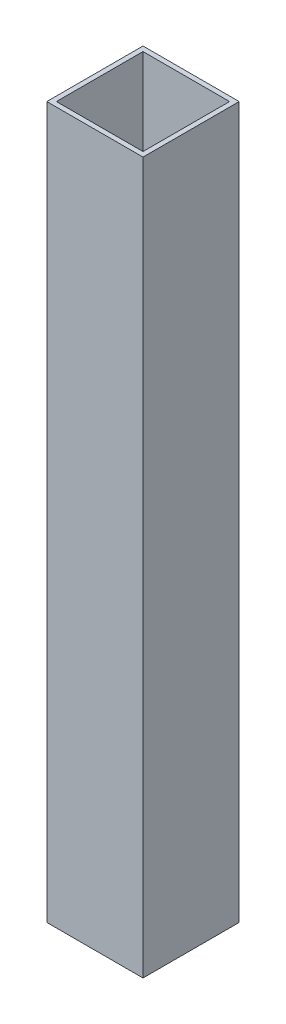
ISO-10303-21;
HEADER;
FILE_DESCRIPTION(('STEP AP214'),'2;1');
FILE_NAME('part.step','',(''),(''),'','','');
FILE_SCHEMA(('AUTOMOTIVE_DESIGN { 1 0 10303 214 1 1 1 1 }'));
ENDSEC;
DATA;
#1=APPLICATION_CONTEXT('core data for automotive mechanical design processes');
#2=APPLICATION_PROTOCOL_DEFINITION('international standard','automotive_design',2000,#1);
#3=PRODUCT_CONTEXT('',#1,'mechanical');
#4=PRODUCT('Part','Part','',(#3));
#5=PRODUCT_RELATED_PRODUCT_CATEGORY('part','',(#4));
#6=PRODUCT_DEFINITION_FORMATION('','',#4);
#7=PRODUCT_DEFINITION_CONTEXT('part definition',#1,'design');
#8=PRODUCT_DEFINITION('design','',#6,#7);
#9=PRODUCT_DEFINITION_SHAPE('','',#8);
#10=(LENGTH_UNIT() NAMED_UNIT(*) SI_UNIT(.MILLI.,.METRE.));
#11=(NAMED_UNIT(*) PLANE_ANGLE_UNIT() SI_UNIT($,.RADIAN.));
#12=(NAMED_UNIT(*) SI_UNIT($,.STERADIAN.) SOLID_ANGLE_UNIT());
#13=UNCERTAINTY_MEASURE_WITH_UNIT(LENGTH_MEASURE(1.E-05),#10,'distance_accuracy_value','');
#14=(GEOMETRIC_REPRESENTATION_CONTEXT(3) GLOBAL_UNCERTAINTY_ASSIGNED_CONTEXT((#13)) GLOBAL_UNIT_ASSIGNED_CONTEXT((#10,
#11,#12)) REPRESENTATION_CONTEXT('',''));
#15=CARTESIAN_POINT('',(0.,0.,0.));
#16=DIRECTION('',(0.,0.,1.));
#17=DIRECTION('',(1.,0.,0.));
#18=AXIS2_PLACEMENT_3D('',#15,#16,#17);
#19=CARTESIAN_POINT('',(0.,147.8,0.));
#20=DIRECTION('',(0.,1.,0.));
#21=DIRECTION('',(0.,0.,1.));
#22=AXIS2_PLACEMENT_3D('',#19,#20,#21);
#23=PLANE('',#22);
#24=DIRECTION('',(0.,0.,-1.));
#25=VECTOR('',#24,1.);
#26=CARTESIAN_POINT('',(10.,147.8,-10.));
#27=LINE('',#26,#25);
#28=CARTESIAN_POINT('',(10.,147.8,10.));
#29=VERTEX_POINT('',#28);
#30=CARTESIAN_POINT('',(10.,147.8,-10.));
#31=VERTEX_POINT('',#30);
#32=EDGE_CURVE('E153',#29,#31,#27,.T.);
#33=ORIENTED_EDGE('',*,*,#32,.T.);
#34=DIRECTION('',(-1.,0.,0.));
#35=VECTOR('',#34,1.);
#36=CARTESIAN_POINT('',(-10.,147.8,-10.));
#37=LINE('',#36,#35);
#38=CARTESIAN_POINT('',(-10.,147.8,-10.));
#39=VERTEX_POINT('',#38);
#40=EDGE_CURVE('E157',#31,#39,#37,.T.);
#41=ORIENTED_EDGE('',*,*,#40,.T.);
#42=DIRECTION('',(0.,0.,1.));
#43=VECTOR('',#42,1.);
#44=CARTESIAN_POINT('',(-10.,147.8,-10.));
#45=LINE('',#44,#43);
#46=CARTESIAN_POINT('',(-10.,147.8,10.));
#47=VERTEX_POINT('',#46);
#48=EDGE_CURVE('E161',#39,#47,#45,.T.);
#49=ORIENTED_EDGE('',*,*,#48,.T.);
#50=DIRECTION('',(1.,0.,0.));
#51=VECTOR('',#50,1.);
#52=CARTESIAN_POINT('',(-10.,147.8,10.));
#53=LINE('',#52,#51);
#54=EDGE_CURVE('E164',#47,#29,#53,.T.);
#55=ORIENTED_EDGE('',*,*,#54,.T.);
#56=EDGE_LOOP('',(#33,#41,#49,#55));
#57=FACE_BOUND('',#56,.T.);
#58=DIRECTION('',(-1.,0.,0.));
#59=VECTOR('',#58,1.);
#60=CARTESIAN_POINT('',(-9.,147.8,-9.));
#61=LINE('',#60,#59);
#62=CARTESIAN_POINT('',(9.,147.8,-9.));
#63=VERTEX_POINT('',#62);
#64=CARTESIAN_POINT('',(-9.,147.8,-9.));
#65=VERTEX_POINT('',#64);
#66=EDGE_CURVE('E114',#63,#65,#61,.T.);
#67=ORIENTED_EDGE('',*,*,#66,.F.);
#68=DIRECTION('',(0.,0.,-1.));
#69=VECTOR('',#68,1.);
#70=CARTESIAN_POINT('',(9.,147.8,-9.));
#71=LINE('',#70,#69);
#72=CARTESIAN_POINT('',(9.00000000000001,147.8,9.));
#73=VERTEX_POINT('',#72);
#74=EDGE_CURVE('E105',#73,#63,#71,.T.);
#75=ORIENTED_EDGE('',*,*,#74,.F.);
#76=DIRECTION('',(1.,0.,0.));
#77=VECTOR('',#76,1.);
#78=CARTESIAN_POINT('',(-8.99999999999999,147.8,9.));
#79=LINE('',#78,#77);
#80=CARTESIAN_POINT('',(-8.99999999999999,147.8,9.));
#81=VERTEX_POINT('',#80);
#82=EDGE_CURVE('E131',#81,#73,#79,.T.);
#83=ORIENTED_EDGE('',*,*,#82,.F.);
#84=DIRECTION('',(0.,0.,1.));
#85=VECTOR('',#84,1.);
#86=CARTESIAN_POINT('',(-9.,147.8,-9.));
#87=LINE('',#86,#85);
#88=EDGE_CURVE('E127',#65,#81,#87,.T.);
#89=ORIENTED_EDGE('',*,*,#88,.F.);
#90=EDGE_LOOP('',(#67,#75,#83,#89));
#91=FACE_BOUND('',#90,.T.);
#92=ADVANCED_FACE('F39',(#57,#91),#23,.T.);
#93=CARTESIAN_POINT('',(0.,0.,0.));
#94=DIRECTION('',(0.,1.,0.));
#95=DIRECTION('',(0.,0.,1.));
#96=AXIS2_PLACEMENT_3D('',#93,#94,#95);
#97=PLANE('',#96);
#98=DIRECTION('',(0.,0.,-1.));
#99=VECTOR('',#98,1.);
#100=CARTESIAN_POINT('',(10.,0.,-10.));
#101=LINE('',#100,#99);
#102=CARTESIAN_POINT('',(10.,0.,10.));
#103=VERTEX_POINT('',#102);
#104=CARTESIAN_POINT('',(10.,0.,-10.));
#105=VERTEX_POINT('',#104);
#106=EDGE_CURVE('E123',#103,#105,#101,.T.);
#107=ORIENTED_EDGE('',*,*,#106,.F.);
#108=DIRECTION('',(1.,0.,0.));
#109=VECTOR('',#108,1.);
#110=CARTESIAN_POINT('',(-10.,0.,10.));
#111=LINE('',#110,#109);
#112=CARTESIAN_POINT('',(-10.,0.,10.));
#113=VERTEX_POINT('',#112);
#114=EDGE_CURVE('E158',#113,#103,#111,.T.);
#115=ORIENTED_EDGE('',*,*,#114,.F.);
#116=DIRECTION('',(0.,0.,1.));
#117=VECTOR('',#116,1.);
#118=CARTESIAN_POINT('',(-10.,0.,-10.));
#119=LINE('',#118,#117);
#120=CARTESIAN_POINT('',(-10.,0.,-10.));
#121=VERTEX_POINT('',#120);
#122=EDGE_CURVE('E174',#121,#113,#119,.T.);
#123=ORIENTED_EDGE('',*,*,#122,.F.);
#124=DIRECTION('',(-1.,0.,0.));
#125=VECTOR('',#124,1.);
#126=CARTESIAN_POINT('',(-10.,0.,-10.));
#127=LINE('',#126,#125);
#128=EDGE_CURVE('E171',#105,#121,#127,.T.);
#129=ORIENTED_EDGE('',*,*,#128,.F.);
#130=EDGE_LOOP('',(#107,#115,#123,#129));
#131=FACE_BOUND('',#130,.T.);
#132=DIRECTION('',(0.,0.,-1.));
#133=VECTOR('',#132,1.);
#134=CARTESIAN_POINT('',(9.,0.,-9.));
#135=LINE('',#134,#133);
#136=CARTESIAN_POINT('',(9.00000000000001,0.,9.));
#137=VERTEX_POINT('',#136);
#138=CARTESIAN_POINT('',(9.,0.,-9.));
#139=VERTEX_POINT('',#138);
#140=EDGE_CURVE('E63',#137,#139,#135,.T.);
#141=ORIENTED_EDGE('',*,*,#140,.T.);
#142=DIRECTION('',(-1.,0.,0.));
#143=VECTOR('',#142,1.);
#144=CARTESIAN_POINT('',(-9.,0.,-9.));
#145=LINE('',#144,#143);
#146=CARTESIAN_POINT('',(-9.,0.,-9.));
#147=VERTEX_POINT('',#146);
#148=EDGE_CURVE('E121',#139,#147,#145,.T.);
#149=ORIENTED_EDGE('',*,*,#148,.T.);
#150=DIRECTION('',(0.,0.,1.));
#151=VECTOR('',#150,1.);
#152=CARTESIAN_POINT('',(-9.,0.,-9.));
#153=LINE('',#152,#151);
#154=CARTESIAN_POINT('',(-8.99999999999999,0.,9.));
#155=VERTEX_POINT('',#154);
#156=EDGE_CURVE('E140',#147,#155,#153,.T.);
#157=ORIENTED_EDGE('',*,*,#156,.T.);
#158=DIRECTION('',(1.,0.,0.));
#159=VECTOR('',#158,1.);
#160=CARTESIAN_POINT('',(-8.99999999999999,0.,9.));
#161=LINE('',#160,#159);
#162=EDGE_CURVE('E115',#155,#137,#161,.T.);
#163=ORIENTED_EDGE('',*,*,#162,.T.);
#164=EDGE_LOOP('',(#141,#149,#157,#163));
#165=FACE_BOUND('',#164,.T.);
#166=ADVANCED_FACE('F197',(#131,#165),#97,.F.);
#167=CARTESIAN_POINT('',(10.,147.8,-10.));
#168=DIRECTION('',(-1.,0.,0.));
#169=DIRECTION('',(0.,0.,1.));
#170=AXIS2_PLACEMENT_3D('',#167,#168,#169);
#171=PLANE('',#170);
#172=ORIENTED_EDGE('',*,*,#106,.T.);
#173=DIRECTION('',(0.,-1.,0.));
#174=VECTOR('',#173,1.);
#175=CARTESIAN_POINT('',(10.,147.8,-10.));
#176=LINE('',#175,#174);
#177=EDGE_CURVE('E11',#31,#105,#176,.T.);
#178=ORIENTED_EDGE('',*,*,#177,.F.);
#179=ORIENTED_EDGE('',*,*,#32,.F.);
#180=DIRECTION('',(0.,-1.,0.));
#181=VECTOR('',#180,1.);
#182=CARTESIAN_POINT('',(10.,147.8,10.));
#183=LINE('',#182,#181);
#184=EDGE_CURVE('E167',#29,#103,#183,.T.);
#185=ORIENTED_EDGE('',*,*,#184,.T.);
#186=EDGE_LOOP('',(#172,#178,#179,#185));
#187=FACE_BOUND('',#186,.T.);
#188=ADVANCED_FACE('F41',(#187),#171,.F.);
#189=CARTESIAN_POINT('',(-10.,147.8,-10.));
#190=DIRECTION('',(0.,0.,1.));
#191=DIRECTION('',(1.,0.,0.));
#192=AXIS2_PLACEMENT_3D('',#189,#190,#191);
#193=PLANE('',#192);
#194=ORIENTED_EDGE('',*,*,#128,.T.);
#195=DIRECTION('',(0.,-1.,0.));
#196=VECTOR('',#195,1.);
#197=CARTESIAN_POINT('',(-10.,147.8,-10.));
#198=LINE('',#197,#196);
#199=EDGE_CURVE('E48',#39,#121,#198,.T.);
#200=ORIENTED_EDGE('',*,*,#199,.F.);
#201=ORIENTED_EDGE('',*,*,#40,.F.);
#202=ORIENTED_EDGE('',*,*,#177,.T.);
#203=EDGE_LOOP('',(#194,#200,#201,#202));
#204=FACE_BOUND('',#203,.T.);
#205=ADVANCED_FACE('F207',(#204),#193,.F.);
#206=CARTESIAN_POINT('',(-10.,147.8,-10.));
#207=DIRECTION('',(1.,0.,0.));
#208=DIRECTION('',(0.,0.,-1.));
#209=AXIS2_PLACEMENT_3D('',#206,#207,#208);
#210=PLANE('',#209);
#211=ORIENTED_EDGE('',*,*,#122,.T.);
#212=DIRECTION('',(0.,-1.,0.));
#213=VECTOR('',#212,1.);
#214=CARTESIAN_POINT('',(-10.,147.8,10.));
#215=LINE('',#214,#213);
#216=EDGE_CURVE('E182',#47,#113,#215,.T.);
#217=ORIENTED_EDGE('',*,*,#216,.F.);
#218=ORIENTED_EDGE('',*,*,#48,.F.);
#219=ORIENTED_EDGE('',*,*,#199,.T.);
#220=EDGE_LOOP('',(#211,#217,#218,#219));
#221=FACE_BOUND('',#220,.T.);
#222=ADVANCED_FACE('F191',(#221),#210,.F.);
#223=CARTESIAN_POINT('',(-10.,147.8,10.));
#224=DIRECTION('',(0.,0.,-1.));
#225=DIRECTION('',(-1.,0.,0.));
#226=AXIS2_PLACEMENT_3D('',#223,#224,#225);
#227=PLANE('',#226);
#228=ORIENTED_EDGE('',*,*,#114,.T.);
#229=ORIENTED_EDGE('',*,*,#184,.F.);
#230=ORIENTED_EDGE('',*,*,#54,.F.);
#231=ORIENTED_EDGE('',*,*,#216,.T.);
#232=EDGE_LOOP('',(#228,#229,#230,#231));
#233=FACE_BOUND('',#232,.T.);
#234=ADVANCED_FACE('F201',(#233),#227,.F.);
#235=CARTESIAN_POINT('',(9.,147.8,-9.));
#236=DIRECTION('',(-1.,0.,0.));
#237=DIRECTION('',(0.,0.,1.));
#238=AXIS2_PLACEMENT_3D('',#235,#236,#237);
#239=PLANE('',#238);
#240=ORIENTED_EDGE('',*,*,#140,.F.);
#241=DIRECTION('',(0.,-1.,0.));
#242=VECTOR('',#241,1.);
#243=CARTESIAN_POINT('',(9.00000000000001,147.8,9.));
#244=LINE('',#243,#242);
#245=EDGE_CURVE('E109',#73,#137,#244,.T.);
#246=ORIENTED_EDGE('',*,*,#245,.F.);
#247=ORIENTED_EDGE('',*,*,#74,.T.);
#248=DIRECTION('',(0.,-1.,0.));
#249=VECTOR('',#248,1.);
#250=CARTESIAN_POINT('',(9.,147.8,-9.));
#251=LINE('',#250,#249);
#252=EDGE_CURVE('E108',#63,#139,#251,.T.);
#253=ORIENTED_EDGE('',*,*,#252,.T.);
#254=EDGE_LOOP('',(#240,#246,#247,#253));
#255=FACE_BOUND('',#254,.T.);
#256=ADVANCED_FACE('F107',(#255),#239,.T.);
#257=CARTESIAN_POINT('',(-9.,147.8,-9.));
#258=DIRECTION('',(0.,0.,1.));
#259=DIRECTION('',(1.,0.,0.));
#260=AXIS2_PLACEMENT_3D('',#257,#258,#259);
#261=PLANE('',#260);
#262=ORIENTED_EDGE('',*,*,#148,.F.);
#263=ORIENTED_EDGE('',*,*,#252,.F.);
#264=ORIENTED_EDGE('',*,*,#66,.T.);
#265=DIRECTION('',(0.,-1.,0.));
#266=VECTOR('',#265,1.);
#267=CARTESIAN_POINT('',(-9.,147.8,-9.));
#268=LINE('',#267,#266);
#269=EDGE_CURVE('E124',#65,#147,#268,.T.);
#270=ORIENTED_EDGE('',*,*,#269,.T.);
#271=EDGE_LOOP('',(#262,#263,#264,#270));
#272=FACE_BOUND('',#271,.T.);
#273=ADVANCED_FACE('F118',(#272),#261,.T.);
#274=CARTESIAN_POINT('',(-9.,147.8,-9.));
#275=DIRECTION('',(1.,0.,0.));
#276=DIRECTION('',(0.,0.,-1.));
#277=AXIS2_PLACEMENT_3D('',#274,#275,#276);
#278=PLANE('',#277);
#279=ORIENTED_EDGE('',*,*,#156,.F.);
#280=ORIENTED_EDGE('',*,*,#269,.F.);
#281=ORIENTED_EDGE('',*,*,#88,.T.);
#282=DIRECTION('',(0.,-1.,0.));
#283=VECTOR('',#282,1.);
#284=CARTESIAN_POINT('',(-8.99999999999999,147.8,9.));
#285=LINE('',#284,#283);
#286=EDGE_CURVE('E55',#81,#155,#285,.T.);
#287=ORIENTED_EDGE('',*,*,#286,.T.);
#288=EDGE_LOOP('',(#279,#280,#281,#287));
#289=FACE_BOUND('',#288,.T.);
#290=ADVANCED_FACE('F230',(#289),#278,.T.);
#291=CARTESIAN_POINT('',(-8.99999999999999,147.8,9.));
#292=DIRECTION('',(0.,0.,-1.));
#293=DIRECTION('',(-1.,0.,0.));
#294=AXIS2_PLACEMENT_3D('',#291,#292,#293);
#295=PLANE('',#294);
#296=ORIENTED_EDGE('',*,*,#162,.F.);
#297=ORIENTED_EDGE('',*,*,#286,.F.);
#298=ORIENTED_EDGE('',*,*,#82,.T.);
#299=ORIENTED_EDGE('',*,*,#245,.T.);
#300=EDGE_LOOP('',(#296,#297,#298,#299));
#301=FACE_BOUND('',#300,.T.);
#302=ADVANCED_FACE('F234',(#301),#295,.T.);
#303=CLOSED_SHELL('',(#92,#166,#188,#205,#222,#234,#256,#273,#290,#302));
#304=MANIFOLD_SOLID_BREP('B2',#303);
#305=ADVANCED_BREP_SHAPE_REPRESENTATION('',(#18,#304),#14);
#306=SHAPE_DEFINITION_REPRESENTATION(#9,#305);
ENDSEC;
END-ISO-10303-21;
